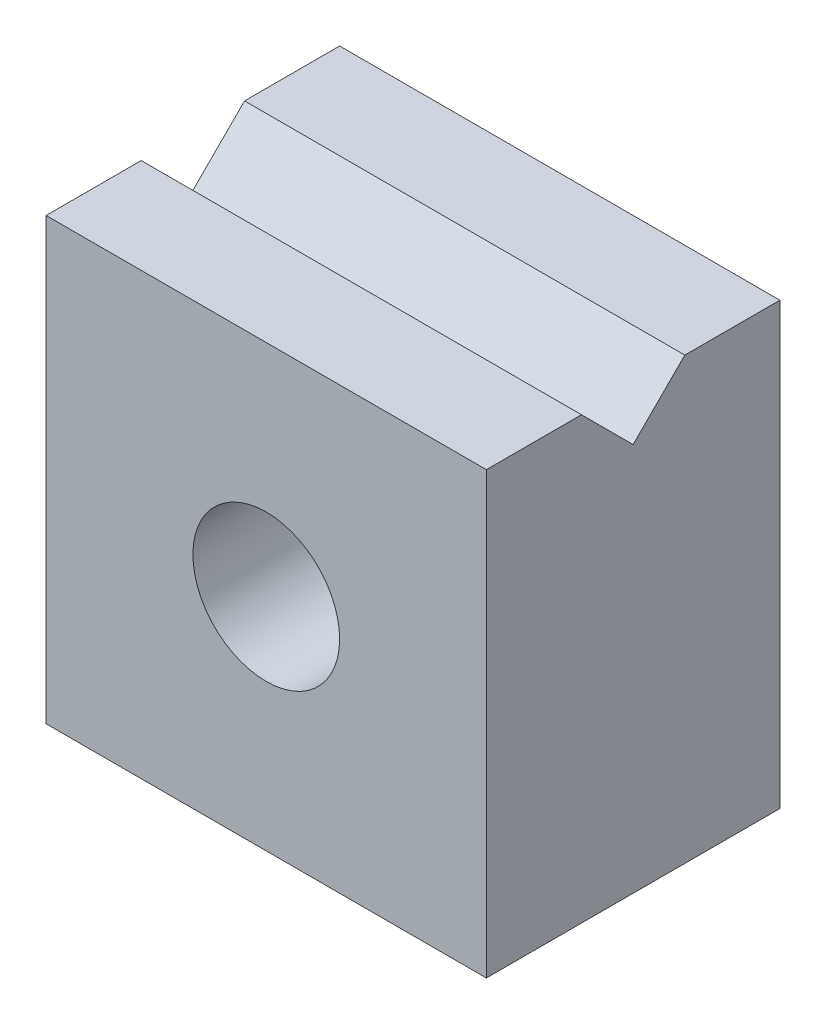
ISO-10303-21;
HEADER;
FILE_DESCRIPTION(('STEP AP214'),'2;1');
FILE_NAME('part.step','',(''),(''),'','','');
FILE_SCHEMA(('AUTOMOTIVE_DESIGN { 1 0 10303 214 1 1 1 1 }'));
ENDSEC;
DATA;
#1=APPLICATION_CONTEXT('core data for automotive mechanical design processes');
#2=APPLICATION_PROTOCOL_DEFINITION('international standard','automotive_design',2000,#1);
#3=PRODUCT_CONTEXT('',#1,'mechanical');
#4=PRODUCT('Part','Part','',(#3));
#5=PRODUCT_RELATED_PRODUCT_CATEGORY('part','',(#4));
#6=PRODUCT_DEFINITION_FORMATION('','',#4);
#7=PRODUCT_DEFINITION_CONTEXT('part definition',#1,'design');
#8=PRODUCT_DEFINITION('design','',#6,#7);
#9=PRODUCT_DEFINITION_SHAPE('','',#8);
#10=(LENGTH_UNIT() NAMED_UNIT(*) SI_UNIT(.MILLI.,.METRE.));
#11=(NAMED_UNIT(*) PLANE_ANGLE_UNIT() SI_UNIT($,.RADIAN.));
#12=(NAMED_UNIT(*) SI_UNIT($,.STERADIAN.) SOLID_ANGLE_UNIT());
#13=UNCERTAINTY_MEASURE_WITH_UNIT(LENGTH_MEASURE(1.E-05),#10,'distance_accuracy_value','');
#14=(GEOMETRIC_REPRESENTATION_CONTEXT(3) GLOBAL_UNCERTAINTY_ASSIGNED_CONTEXT((#13)) GLOBAL_UNIT_ASSIGNED_CONTEXT((#10,
#11,#12)) REPRESENTATION_CONTEXT('',''));
#15=CARTESIAN_POINT('',(0.,0.,0.));
#16=DIRECTION('',(0.,0.,1.));
#17=DIRECTION('',(1.,0.,0.));
#18=AXIS2_PLACEMENT_3D('',#15,#16,#17);
#19=CARTESIAN_POINT('',(-9.52500000000001,9.525,12.7));
#20=DIRECTION('',(0.,-1.,0.));
#21=DIRECTION('',(0.,0.,-1.));
#22=AXIS2_PLACEMENT_3D('',#19,#20,#21);
#23=PLANE('',#22);
#24=DIRECTION('',(0.,0.,-1.));
#25=VECTOR('',#24,1.);
#26=CARTESIAN_POINT('',(9.525,9.525,12.7));
#27=LINE('',#26,#25);
#28=CARTESIAN_POINT('',(9.525,9.525,12.7));
#29=VERTEX_POINT('',#28);
#30=CARTESIAN_POINT('',(9.525,9.525,8.58520000000002));
#31=VERTEX_POINT('',#30);
#32=EDGE_CURVE('E11',#29,#31,#27,.T.);
#33=ORIENTED_EDGE('',*,*,#32,.T.);
#34=DIRECTION('',(1.,0.,0.));
#35=VECTOR('',#34,1.);
#36=CARTESIAN_POINT('',(-9.52500000000001,9.525,8.58520000000002));
#37=LINE('',#36,#35);
#38=CARTESIAN_POINT('',(-9.52500000000001,9.525,8.58520000000002));
#39=VERTEX_POINT('',#38);
#40=EDGE_CURVE('E136',#39,#31,#37,.T.);
#41=ORIENTED_EDGE('',*,*,#40,.F.);
#42=DIRECTION('',(0.,0.,-1.));
#43=VECTOR('',#42,1.);
#44=CARTESIAN_POINT('',(-9.52500000000001,9.525,12.7));
#45=LINE('',#44,#43);
#46=CARTESIAN_POINT('',(-9.52500000000001,9.525,12.7));
#47=VERTEX_POINT('',#46);
#48=EDGE_CURVE('E127',#47,#39,#45,.T.);
#49=ORIENTED_EDGE('',*,*,#48,.F.);
#50=DIRECTION('',(-1.,0.,0.));
#51=VECTOR('',#50,1.);
#52=CARTESIAN_POINT('',(-9.52500000000001,9.525,12.7));
#53=LINE('',#52,#51);
#54=EDGE_CURVE('E92',#29,#47,#53,.T.);
#55=ORIENTED_EDGE('',*,*,#54,.F.);
#56=EDGE_LOOP('',(#33,#41,#49,#55));
#57=FACE_BOUND('',#56,.T.);
#58=ADVANCED_FACE('F39',(#57),#23,.F.);
#59=CARTESIAN_POINT('',(9.525,-9.525,12.7));
#60=DIRECTION('',(-1.,0.,0.));
#61=DIRECTION('',(0.,0.,1.));
#62=AXIS2_PLACEMENT_3D('',#59,#60,#61);
#63=PLANE('',#62);
#64=DIRECTION('',(0.,0.707106781186554,-0.707106781186541));
#65=VECTOR('',#64,1.);
#66=CARTESIAN_POINT('',(9.525,7.2898,6.35));
#67=LINE('',#66,#65);
#68=CARTESIAN_POINT('',(9.525,7.2898,6.35));
#69=VERTEX_POINT('',#68);
#70=CARTESIAN_POINT('',(9.525,9.525,4.11480000000004));
#71=VERTEX_POINT('',#70);
#72=EDGE_CURVE('E129',#69,#71,#67,.T.);
#73=ORIENTED_EDGE('',*,*,#72,.F.);
#74=DIRECTION('',(0.,-0.707106781186544,-0.707106781186551));
#75=VECTOR('',#74,1.);
#76=CARTESIAN_POINT('',(9.525,9.525,8.58520000000002));
#77=LINE('',#76,#75);
#78=EDGE_CURVE('E114',#31,#69,#77,.T.);
#79=ORIENTED_EDGE('',*,*,#78,.F.);
#80=ORIENTED_EDGE('',*,*,#32,.F.);
#81=DIRECTION('',(0.,1.,0.));
#82=VECTOR('',#81,1.);
#83=CARTESIAN_POINT('',(9.525,-9.525,12.7));
#84=LINE('',#83,#82);
#85=CARTESIAN_POINT('',(9.525,-9.525,12.7));
#86=VERTEX_POINT('',#85);
#87=EDGE_CURVE('E150',#86,#29,#84,.T.);
#88=ORIENTED_EDGE('',*,*,#87,.F.);
#89=DIRECTION('',(0.,0.,-1.));
#90=VECTOR('',#89,1.);
#91=CARTESIAN_POINT('',(9.525,-9.525,12.7));
#92=LINE('',#91,#90);
#93=CARTESIAN_POINT('',(9.525,-9.525,0.));
#94=VERTEX_POINT('',#93);
#95=EDGE_CURVE('E160',#86,#94,#92,.T.);
#96=ORIENTED_EDGE('',*,*,#95,.T.);
#97=DIRECTION('',(0.,1.,0.));
#98=VECTOR('',#97,1.);
#99=CARTESIAN_POINT('',(9.525,-9.525,0.));
#100=LINE('',#99,#98);
#101=CARTESIAN_POINT('',(9.525,9.525,0.));
#102=VERTEX_POINT('',#101);
#103=EDGE_CURVE('E146',#94,#102,#100,.T.);
#104=ORIENTED_EDGE('',*,*,#103,.T.);
#105=EDGE_CURVE('E48',#71,#102,#27,.T.);
#106=ORIENTED_EDGE('',*,*,#105,.F.);
#107=EDGE_LOOP('',(#73,#79,#80,#88,#96,#104,#106));
#108=FACE_BOUND('',#107,.T.);
#109=ADVANCED_FACE('F41',(#108),#63,.F.);
#110=CARTESIAN_POINT('',(-9.52500000000001,9.525,4.11480000000004));
#111=VERTEX_POINT('',#110);
#112=CARTESIAN_POINT('',(-9.52500000000001,9.525,0.));
#113=VERTEX_POINT('',#112);
#114=EDGE_CURVE('E177',#111,#113,#45,.T.);
#115=ORIENTED_EDGE('',*,*,#114,.F.);
#116=DIRECTION('',(1.,0.,0.));
#117=VECTOR('',#116,1.);
#118=CARTESIAN_POINT('',(-9.52500000000001,9.525,4.11480000000004));
#119=LINE('',#118,#117);
#120=EDGE_CURVE('E55',#111,#71,#119,.T.);
#121=ORIENTED_EDGE('',*,*,#120,.T.);
#122=ORIENTED_EDGE('',*,*,#105,.T.);
#123=DIRECTION('',(-1.,0.,0.));
#124=VECTOR('',#123,1.);
#125=CARTESIAN_POINT('',(-9.52500000000001,9.525,0.));
#126=LINE('',#125,#124);
#127=EDGE_CURVE('E164',#102,#113,#126,.T.);
#128=ORIENTED_EDGE('',*,*,#127,.T.);
#129=EDGE_LOOP('',(#115,#121,#122,#128));
#130=FACE_BOUND('',#129,.T.);
#131=ADVANCED_FACE('F185',(#130),#23,.F.);
#132=CARTESIAN_POINT('',(-9.52500000000001,-9.525,12.7));
#133=DIRECTION('',(1.,0.,0.));
#134=DIRECTION('',(0.,0.,-1.));
#135=AXIS2_PLACEMENT_3D('',#132,#133,#134);
#136=PLANE('',#135);
#137=ORIENTED_EDGE('',*,*,#48,.T.);
#138=DIRECTION('',(0.,-0.707106781186544,-0.707106781186551));
#139=VECTOR('',#138,1.);
#140=CARTESIAN_POINT('',(-9.52500000000001,9.525,8.58520000000002));
#141=LINE('',#140,#139);
#142=CARTESIAN_POINT('',(-9.52500000000001,7.2898,6.35));
#143=VERTEX_POINT('',#142);
#144=EDGE_CURVE('E111',#39,#143,#141,.T.);
#145=ORIENTED_EDGE('',*,*,#144,.T.);
#146=DIRECTION('',(0.,0.707106781186554,-0.707106781186541));
#147=VECTOR('',#146,1.);
#148=CARTESIAN_POINT('',(-9.52500000000001,7.2898,6.35));
#149=LINE('',#148,#147);
#150=EDGE_CURVE('E117',#143,#111,#149,.T.);
#151=ORIENTED_EDGE('',*,*,#150,.T.);
#152=ORIENTED_EDGE('',*,*,#114,.T.);
#153=DIRECTION('',(0.,-1.,0.));
#154=VECTOR('',#153,1.);
#155=CARTESIAN_POINT('',(-9.52500000000001,-9.525,0.));
#156=LINE('',#155,#154);
#157=CARTESIAN_POINT('',(-9.52500000000001,-9.525,0.));
#158=VERTEX_POINT('',#157);
#159=EDGE_CURVE('E168',#113,#158,#156,.T.);
#160=ORIENTED_EDGE('',*,*,#159,.T.);
#161=DIRECTION('',(0.,0.,-1.));
#162=VECTOR('',#161,1.);
#163=CARTESIAN_POINT('',(-9.52500000000001,-9.525,12.7));
#164=LINE('',#163,#162);
#165=CARTESIAN_POINT('',(-9.52500000000001,-9.525,12.7));
#166=VERTEX_POINT('',#165);
#167=EDGE_CURVE('E175',#166,#158,#164,.T.);
#168=ORIENTED_EDGE('',*,*,#167,.F.);
#169=DIRECTION('',(0.,-1.,0.));
#170=VECTOR('',#169,1.);
#171=CARTESIAN_POINT('',(-9.52500000000001,-9.525,12.7));
#172=LINE('',#171,#170);
#173=EDGE_CURVE('E155',#47,#166,#172,.T.);
#174=ORIENTED_EDGE('',*,*,#173,.F.);
#175=EDGE_LOOP('',(#137,#145,#151,#152,#160,#168,#174));
#176=FACE_BOUND('',#175,.T.);
#177=ADVANCED_FACE('F125',(#176),#136,.F.);
#178=CARTESIAN_POINT('',(-9.52500000000001,-9.525,12.7));
#179=DIRECTION('',(0.,1.,0.));
#180=DIRECTION('',(0.,0.,1.));
#181=AXIS2_PLACEMENT_3D('',#178,#179,#180);
#182=PLANE('',#181);
#183=DIRECTION('',(1.,0.,0.));
#184=VECTOR('',#183,1.);
#185=CARTESIAN_POINT('',(-9.52500000000001,-9.525,0.));
#186=LINE('',#185,#184);
#187=EDGE_CURVE('E85',#158,#94,#186,.T.);
#188=ORIENTED_EDGE('',*,*,#187,.T.);
#189=ORIENTED_EDGE('',*,*,#95,.F.);
#190=DIRECTION('',(1.,0.,0.));
#191=VECTOR('',#190,1.);
#192=CARTESIAN_POINT('',(-9.52500000000001,-9.525,12.7));
#193=LINE('',#192,#191);
#194=EDGE_CURVE('E64',#166,#86,#193,.T.);
#195=ORIENTED_EDGE('',*,*,#194,.F.);
#196=ORIENTED_EDGE('',*,*,#167,.T.);
#197=EDGE_LOOP('',(#188,#189,#195,#196));
#198=FACE_BOUND('',#197,.T.);
#199=ADVANCED_FACE('F193',(#198),#182,.F.);
#200=CARTESIAN_POINT('',(0.,0.,12.7));
#201=DIRECTION('',(0.,0.,-1.));
#202=DIRECTION('',(-1.,0.,0.));
#203=AXIS2_PLACEMENT_3D('',#200,#201,#202);
#204=PLANE('',#203);
#205=CARTESIAN_POINT('',(0.,0.,12.7));
#206=DIRECTION('',(0.,0.,1.));
#207=DIRECTION('',(1.,0.,0.));
#208=AXIS2_PLACEMENT_3D('',#205,#206,#207);
#209=CIRCLE('',#208,3.175);
#210=CARTESIAN_POINT('',(3.175,0.,12.7));
#211=VERTEX_POINT('',#210);
#212=EDGE_CURVE('E139',#211,#211,#209,.T.);
#213=ORIENTED_EDGE('',*,*,#212,.F.);
#214=EDGE_LOOP('',(#213));
#215=FACE_BOUND('',#214,.T.);
#216=ORIENTED_EDGE('',*,*,#87,.T.);
#217=ORIENTED_EDGE('',*,*,#54,.T.);
#218=ORIENTED_EDGE('',*,*,#173,.T.);
#219=ORIENTED_EDGE('',*,*,#194,.T.);
#220=EDGE_LOOP('',(#216,#217,#218,#219));
#221=FACE_BOUND('',#220,.T.);
#222=ADVANCED_FACE('F194',(#215,#221),#204,.F.);
#223=CARTESIAN_POINT('',(0.,0.,0.));
#224=DIRECTION('',(0.,0.,-1.));
#225=DIRECTION('',(-1.,0.,0.));
#226=AXIS2_PLACEMENT_3D('',#223,#224,#225);
#227=PLANE('',#226);
#228=CARTESIAN_POINT('',(0.,0.,0.));
#229=DIRECTION('',(0.,0.,1.));
#230=DIRECTION('',(1.,0.,0.));
#231=AXIS2_PLACEMENT_3D('',#228,#229,#230);
#232=CIRCLE('',#231,3.175);
#233=CARTESIAN_POINT('',(3.175,0.,0.));
#234=VERTEX_POINT('',#233);
#235=EDGE_CURVE('E142',#234,#234,#232,.T.);
#236=ORIENTED_EDGE('',*,*,#235,.T.);
#237=EDGE_LOOP('',(#236));
#238=FACE_BOUND('',#237,.T.);
#239=ORIENTED_EDGE('',*,*,#103,.F.);
#240=ORIENTED_EDGE('',*,*,#187,.F.);
#241=ORIENTED_EDGE('',*,*,#159,.F.);
#242=ORIENTED_EDGE('',*,*,#127,.F.);
#243=EDGE_LOOP('',(#239,#240,#241,#242));
#244=FACE_BOUND('',#243,.T.);
#245=ADVANCED_FACE('F189',(#238,#244),#227,.T.);
#246=CARTESIAN_POINT('',(0.,0.,0.));
#247=DIRECTION('',(0.,0.,1.));
#248=DIRECTION('',(1.,0.,0.));
#249=AXIS2_PLACEMENT_3D('',#246,#247,#248);
#250=CYLINDRICAL_SURFACE('',#249,3.175);
#251=ORIENTED_EDGE('',*,*,#235,.F.);
#252=EDGE_LOOP('',(#251));
#253=FACE_BOUND('',#252,.T.);
#254=ORIENTED_EDGE('',*,*,#212,.T.);
#255=EDGE_LOOP('',(#254));
#256=FACE_BOUND('',#255,.T.);
#257=ADVANCED_FACE('F211',(#253,#256),#250,.F.);
#258=CARTESIAN_POINT('',(-9.52500000000001,9.525,8.58520000000002));
#259=DIRECTION('',(0.,-0.707106781186551,0.707106781186544));
#260=DIRECTION('',(0.,-0.707106781186544,-0.707106781186551));
#261=AXIS2_PLACEMENT_3D('',#258,#259,#260);
#262=PLANE('',#261);
#263=ORIENTED_EDGE('',*,*,#78,.T.);
#264=DIRECTION('',(1.,0.,0.));
#265=VECTOR('',#264,1.);
#266=CARTESIAN_POINT('',(-9.52500000000001,7.2898,6.35));
#267=LINE('',#266,#265);
#268=EDGE_CURVE('E108',#143,#69,#267,.T.);
#269=ORIENTED_EDGE('',*,*,#268,.F.);
#270=ORIENTED_EDGE('',*,*,#144,.F.);
#271=ORIENTED_EDGE('',*,*,#40,.T.);
#272=EDGE_LOOP('',(#263,#269,#270,#271));
#273=FACE_BOUND('',#272,.T.);
#274=ADVANCED_FACE('F109',(#273),#262,.F.);
#275=CARTESIAN_POINT('',(-9.52500000000001,7.2898,6.35));
#276=DIRECTION('',(0.,-0.707106781186541,-0.707106781186554));
#277=DIRECTION('',(0.,0.707106781186554,-0.707106781186541));
#278=AXIS2_PLACEMENT_3D('',#275,#276,#277);
#279=PLANE('',#278);
#280=ORIENTED_EDGE('',*,*,#72,.T.);
#281=ORIENTED_EDGE('',*,*,#120,.F.);
#282=ORIENTED_EDGE('',*,*,#150,.F.);
#283=ORIENTED_EDGE('',*,*,#268,.T.);
#284=EDGE_LOOP('',(#280,#281,#282,#283));
#285=FACE_BOUND('',#284,.T.);
#286=ADVANCED_FACE('F119',(#285),#279,.F.);
#287=CLOSED_SHELL('',(#58,#109,#131,#177,#199,#222,#245,#257,#274,#286));
#288=MANIFOLD_SOLID_BREP('B2',#287);
#289=ADVANCED_BREP_SHAPE_REPRESENTATION('',(#18,#288),#14);
#290=SHAPE_DEFINITION_REPRESENTATION(#9,#289);
ENDSEC;
END-ISO-10303-21;
